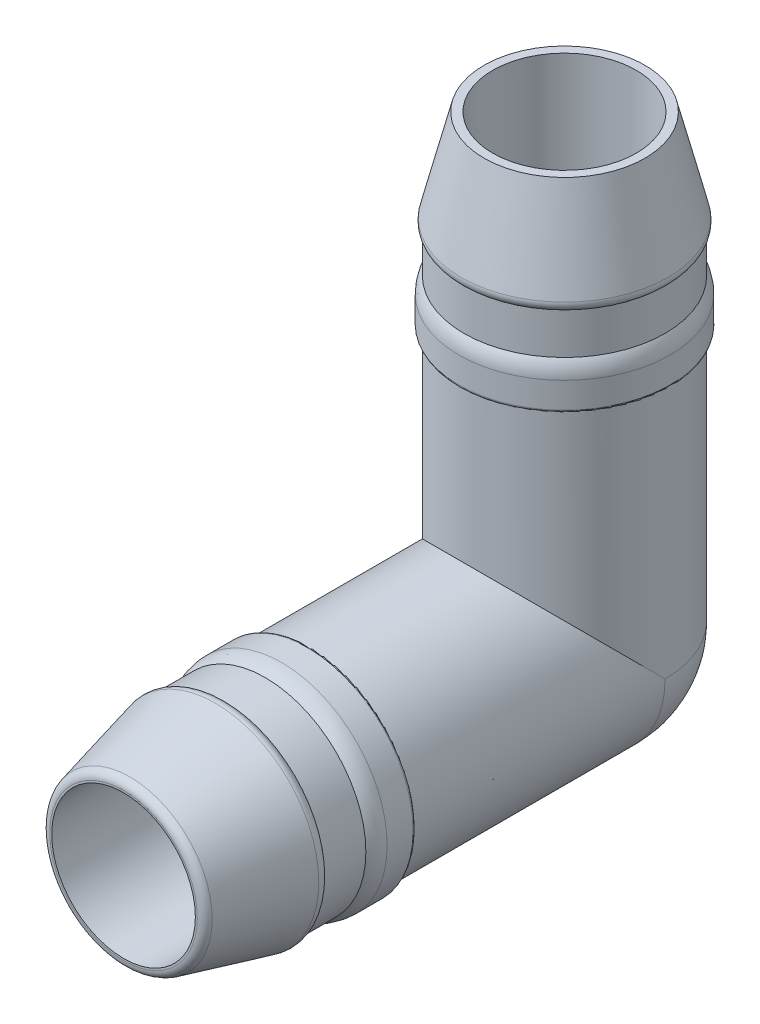
ISO-10303-21;
HEADER;
FILE_DESCRIPTION(('STEP AP214'),'2;1');
FILE_NAME('part.step','',(''),(''),'','','');
FILE_SCHEMA(('AUTOMOTIVE_DESIGN { 1 0 10303 214 1 1 1 1 }'));
ENDSEC;
DATA;
#1=APPLICATION_CONTEXT('core data for automotive mechanical design processes');
#2=APPLICATION_PROTOCOL_DEFINITION('international standard','automotive_design',2000,#1);
#3=PRODUCT_CONTEXT('',#1,'mechanical');
#4=PRODUCT('Part','Part','',(#3));
#5=PRODUCT_RELATED_PRODUCT_CATEGORY('part','',(#4));
#6=PRODUCT_DEFINITION_FORMATION('','',#4);
#7=PRODUCT_DEFINITION_CONTEXT('part definition',#1,'design');
#8=PRODUCT_DEFINITION('design','',#6,#7);
#9=PRODUCT_DEFINITION_SHAPE('','',#8);
#10=(LENGTH_UNIT() NAMED_UNIT(*) SI_UNIT(.MILLI.,.METRE.));
#11=(NAMED_UNIT(*) PLANE_ANGLE_UNIT() SI_UNIT($,.RADIAN.));
#12=(NAMED_UNIT(*) SI_UNIT($,.STERADIAN.) SOLID_ANGLE_UNIT());
#13=UNCERTAINTY_MEASURE_WITH_UNIT(LENGTH_MEASURE(1.E-05),#10,'distance_accuracy_value','');
#14=(GEOMETRIC_REPRESENTATION_CONTEXT(3) GLOBAL_UNCERTAINTY_ASSIGNED_CONTEXT((#13)) GLOBAL_UNIT_ASSIGNED_CONTEXT((#10,
#11,#12)) REPRESENTATION_CONTEXT('',''));
#15=CARTESIAN_POINT('',(0.,0.,0.));
#16=DIRECTION('',(0.,0.,1.));
#17=DIRECTION('',(1.,0.,0.));
#18=AXIS2_PLACEMENT_3D('',#15,#16,#17);
#19=CARTESIAN_POINT('',(0.,0.,8.85));
#20=DIRECTION('',(0.,0.,-1.));
#21=DIRECTION('',(-1.,0.,0.));
#22=AXIS2_PLACEMENT_3D('',#19,#20,#21);
#23=CYLINDRICAL_SURFACE('',#22,3.5);
#24=CARTESIAN_POINT('',(0.,0.,8.85));
#25=DIRECTION('',(0.,0.,1.));
#26=DIRECTION('',(1.,0.,0.));
#27=AXIS2_PLACEMENT_3D('',#24,#25,#26);
#28=CIRCLE('',#27,3.5);
#29=CARTESIAN_POINT('',(3.5,0.,8.85));
#30=VERTEX_POINT('',#29);
#31=EDGE_CURVE('E60',#30,#30,#28,.T.);
#32=ORIENTED_EDGE('',*,*,#31,.F.);
#33=EDGE_LOOP('',(#32));
#34=FACE_BOUND('',#33,.T.);
#35=CARTESIAN_POINT('',(0.,0.,0.));
#36=DIRECTION('',(0.,0.707106781186547,-0.707106781186547));
#37=DIRECTION('',(0.,-0.707106781186547,-0.707106781186547));
#38=AXIS2_PLACEMENT_3D('',#35,#36,#37);
#39=ELLIPSE('',#38,4.94974746830583,3.5);
#40=CARTESIAN_POINT('',(-3.5,0.,0.));
#41=VERTEX_POINT('',#40);
#42=CARTESIAN_POINT('',(3.5,0.,0.));
#43=VERTEX_POINT('',#42);
#44=EDGE_CURVE('E59',#41,#43,#39,.T.);
#45=ORIENTED_EDGE('',*,*,#44,.F.);
#46=CARTESIAN_POINT('',(0.,0.,0.));
#47=DIRECTION('',(0.,0.,1.));
#48=DIRECTION('',(1.,0.,0.));
#49=AXIS2_PLACEMENT_3D('',#46,#47,#48);
#50=CIRCLE('',#49,3.5);
#51=EDGE_CURVE('E48',#41,#43,#50,.T.);
#52=ORIENTED_EDGE('',*,*,#51,.T.);
#53=EDGE_LOOP('',(#45,#52));
#54=FACE_BOUND('',#53,.T.);
#55=ADVANCED_FACE('F33',(#34,#54),#23,.T.);
#56=CARTESIAN_POINT('',(0.,0.,10.85));
#57=DIRECTION('',(0.,0.,-1.));
#58=DIRECTION('',(-1.,0.,0.));
#59=AXIS2_PLACEMENT_3D('',#56,#57,#58);
#60=CYLINDRICAL_SURFACE('',#59,3.675);
#61=CARTESIAN_POINT('',(0.,0.,8.95));
#62=DIRECTION('',(0.,0.,1.));
#63=DIRECTION('',(1.,0.,0.));
#64=AXIS2_PLACEMENT_3D('',#61,#62,#63);
#65=CIRCLE('',#64,3.675);
#66=CARTESIAN_POINT('',(3.675,0.,8.95));
#67=VERTEX_POINT('',#66);
#68=EDGE_CURVE('E87',#67,#67,#65,.T.);
#69=ORIENTED_EDGE('',*,*,#68,.T.);
#70=EDGE_LOOP('',(#69));
#71=FACE_BOUND('',#70,.T.);
#72=CARTESIAN_POINT('',(0.,0.,9.85));
#73=DIRECTION('',(0.,0.,1.));
#74=DIRECTION('',(1.,0.,0.));
#75=AXIS2_PLACEMENT_3D('',#72,#73,#74);
#76=CIRCLE('',#75,3.675);
#77=CARTESIAN_POINT('',(3.675,0.,9.85));
#78=VERTEX_POINT('',#77);
#79=EDGE_CURVE('E71',#78,#78,#76,.F.);
#80=ORIENTED_EDGE('',*,*,#79,.T.);
#81=EDGE_LOOP('',(#80));
#82=FACE_BOUND('',#81,.T.);
#83=ADVANCED_FACE('F123',(#71,#82),#60,.T.);
#84=CARTESIAN_POINT('',(0.,0.,8.85));
#85=DIRECTION('',(0.,0.,1.));
#86=DIRECTION('',(1.,0.,0.));
#87=AXIS2_PLACEMENT_3D('',#84,#85,#86);
#88=PLANE('',#87);
#89=CARTESIAN_POINT('',(0.,0.,8.85));
#90=DIRECTION('',(0.,0.,1.));
#91=DIRECTION('',(1.,0.,0.));
#92=AXIS2_PLACEMENT_3D('',#89,#90,#91);
#93=CIRCLE('',#92,3.575);
#94=CARTESIAN_POINT('',(3.575,0.,8.85));
#95=VERTEX_POINT('',#94);
#96=EDGE_CURVE('E90',#95,#95,#93,.F.);
#97=ORIENTED_EDGE('',*,*,#96,.T.);
#98=EDGE_LOOP('',(#97));
#99=FACE_BOUND('',#98,.T.);
#100=ORIENTED_EDGE('',*,*,#31,.T.);
#101=EDGE_LOOP('',(#100));
#102=FACE_BOUND('',#101,.T.);
#103=ADVANCED_FACE('F129',(#99,#102),#88,.F.);
#104=CARTESIAN_POINT('',(0.,0.,9.85));
#105=DIRECTION('',(0.,0.,1.));
#106=DIRECTION('',(1.,0.,0.));
#107=AXIS2_PLACEMENT_3D('',#104,#105,#106);
#108=TOROIDAL_SURFACE('',#107,2.675,1.);
#109=CARTESIAN_POINT('',(0.,0.,10.4151327277729));
#110=DIRECTION('',(0.,0.,-1.));
#111=DIRECTION('',(-1.,0.,0.));
#112=AXIS2_PLACEMENT_3D('',#109,#110,#111);
#113=CIRCLE('',#112,3.5);
#114=CARTESIAN_POINT('',(-3.5,0.,10.4151327277729));
#115=VERTEX_POINT('',#114);
#116=EDGE_CURVE('E75',#115,#115,#113,.F.);
#117=ORIENTED_EDGE('',*,*,#116,.F.);
#118=EDGE_LOOP('',(#117));
#119=FACE_BOUND('',#118,.T.);
#120=ORIENTED_EDGE('',*,*,#79,.F.);
#121=EDGE_LOOP('',(#120));
#122=FACE_BOUND('',#121,.T.);
#123=ADVANCED_FACE('F135',(#119,#122),#108,.T.);
#124=CARTESIAN_POINT('',(0.,0.,-1.07570752618058));
#125=DIRECTION('',(0.,0.,1.));
#126=DIRECTION('',(1.,0.,0.));
#127=AXIS2_PLACEMENT_3D('',#124,#125,#126);
#128=CYLINDRICAL_SURFACE('',#127,3.5);
#129=ORIENTED_EDGE('',*,*,#116,.T.);
#130=EDGE_LOOP('',(#129));
#131=FACE_BOUND('',#130,.T.);
#132=CARTESIAN_POINT('',(0.,0.,11.85));
#133=DIRECTION('',(0.,0.,1.));
#134=DIRECTION('',(1.,0.,0.));
#135=AXIS2_PLACEMENT_3D('',#132,#133,#134);
#136=CIRCLE('',#135,3.5);
#137=CARTESIAN_POINT('',(3.5,0.,11.85));
#138=VERTEX_POINT('',#137);
#139=EDGE_CURVE('E61',#138,#138,#136,.T.);
#140=ORIENTED_EDGE('',*,*,#139,.F.);
#141=EDGE_LOOP('',(#140));
#142=FACE_BOUND('',#141,.T.);
#143=ADVANCED_FACE('F138',(#131,#142),#128,.T.);
#144=CARTESIAN_POINT('',(0.,0.,11.85));
#145=DIRECTION('',(0.,0.,-1.));
#146=DIRECTION('',(1.,0.,0.));
#147=AXIS2_PLACEMENT_3D('',#144,#145,#146);
#148=CONICAL_SURFACE('',#147,3.675,0.244346095279207);
#149=CARTESIAN_POINT('',(0.,0.,12.1533251530703));
#150=DIRECTION('',(0.,0.,1.));
#151=DIRECTION('',(1.,0.,0.));
#152=AXIS2_PLACEMENT_3D('',#149,#150,#151);
#153=CIRCLE('',#152,3.59937254537288);
#154=CARTESIAN_POINT('',(3.59937254537288,0.,12.1533251530703));
#155=VERTEX_POINT('',#154);
#156=EDGE_CURVE('E81',#155,#155,#153,.T.);
#157=ORIENTED_EDGE('',*,*,#156,.T.);
#158=EDGE_LOOP('',(#157));
#159=FACE_BOUND('',#158,.T.);
#160=CARTESIAN_POINT('',(0.,0.,15.1225765686799));
#161=DIRECTION('',(0.,0.,-1.));
#162=DIRECTION('',(-1.,0.,0.));
#163=AXIS2_PLACEMENT_3D('',#160,#161,#162);
#164=CIRCLE('',#163,2.85905501997965);
#165=CARTESIAN_POINT('',(-2.85905501997965,0.,15.1225765686799));
#166=VERTEX_POINT('',#165);
#167=EDGE_CURVE('E78',#166,#166,#164,.T.);
#168=ORIENTED_EDGE('',*,*,#167,.T.);
#169=EDGE_LOOP('',(#168));
#170=FACE_BOUND('',#169,.T.);
#171=ADVANCED_FACE('F180',(#159,#170),#148,.T.);
#172=CARTESIAN_POINT('',(0.,0.,15.35));
#173=DIRECTION('',(0.,0.,1.));
#174=DIRECTION('',(1.,0.,0.));
#175=AXIS2_PLACEMENT_3D('',#172,#173,#174);
#176=PLANE('',#175);
#177=CARTESIAN_POINT('',(0.,0.,15.35));
#178=DIRECTION('',(0.,0.,1.));
#179=DIRECTION('',(1.,0.,0.));
#180=AXIS2_PLACEMENT_3D('',#177,#178,#179);
#181=CIRCLE('',#180,2.5);
#182=CARTESIAN_POINT('',(2.5,0.,15.35));
#183=VERTEX_POINT('',#182);
#184=EDGE_CURVE('E320',#183,#183,#181,.T.);
#185=ORIENTED_EDGE('',*,*,#184,.F.);
#186=EDGE_LOOP('',(#185));
#187=FACE_BOUND('',#186,.T.);
#188=CARTESIAN_POINT('',(0.,0.,15.35));
#189=DIRECTION('',(0.,0.,1.));
#190=DIRECTION('',(1.,0.,0.));
#191=AXIS2_PLACEMENT_3D('',#188,#189,#190);
#192=CIRCLE('',#191,2.56796630209685);
#193=CARTESIAN_POINT('',(2.56796630209685,0.,15.35));
#194=VERTEX_POINT('',#193);
#195=EDGE_CURVE('E84',#194,#194,#192,.T.);
#196=ORIENTED_EDGE('',*,*,#195,.T.);
#197=EDGE_LOOP('',(#196));
#198=FACE_BOUND('',#197,.T.);
#199=ADVANCED_FACE('F144',(#187,#198),#176,.T.);
#200=CARTESIAN_POINT('',(0.,0.,12.0807485843904));
#201=DIRECTION('',(0.,0.,-1.));
#202=DIRECTION('',(-1.,0.,0.));
#203=AXIS2_PLACEMENT_3D('',#200,#201,#202);
#204=TOROIDAL_SURFACE('',#203,3.30828382749009,0.3);
#205=ORIENTED_EDGE('',*,*,#139,.T.);
#206=EDGE_LOOP('',(#205));
#207=FACE_BOUND('',#206,.T.);
#208=ORIENTED_EDGE('',*,*,#156,.F.);
#209=EDGE_LOOP('',(#208));
#210=FACE_BOUND('',#209,.T.);
#211=ADVANCED_FACE('F140',(#207,#210),#204,.T.);
#212=CARTESIAN_POINT('',(0.,0.,15.05));
#213=DIRECTION('',(0.,0.,1.));
#214=DIRECTION('',(1.,0.,0.));
#215=AXIS2_PLACEMENT_3D('',#212,#213,#214);
#216=TOROIDAL_SURFACE('',#215,2.56796630209685,0.3);
#217=ORIENTED_EDGE('',*,*,#167,.F.);
#218=EDGE_LOOP('',(#217));
#219=FACE_BOUND('',#218,.T.);
#220=ORIENTED_EDGE('',*,*,#195,.F.);
#221=EDGE_LOOP('',(#220));
#222=FACE_BOUND('',#221,.T.);
#223=ADVANCED_FACE('F143',(#219,#222),#216,.T.);
#224=CARTESIAN_POINT('',(0.,0.,8.95));
#225=DIRECTION('',(0.,0.,1.));
#226=DIRECTION('',(1.,0.,0.));
#227=AXIS2_PLACEMENT_3D('',#224,#225,#226);
#228=TOROIDAL_SURFACE('',#227,3.575,0.1);
#229=ORIENTED_EDGE('',*,*,#96,.F.);
#230=EDGE_LOOP('',(#229));
#231=FACE_BOUND('',#230,.T.);
#232=ORIENTED_EDGE('',*,*,#68,.F.);
#233=EDGE_LOOP('',(#232));
#234=FACE_BOUND('',#233,.T.);
#235=ADVANCED_FACE('F148',(#231,#234),#228,.T.);
#236=CARTESIAN_POINT('',(0.,8.85,0.));
#237=DIRECTION('',(0.,-1.,0.));
#238=DIRECTION('',(0.,0.,-1.));
#239=AXIS2_PLACEMENT_3D('',#236,#237,#238);
#240=CYLINDRICAL_SURFACE('',#239,3.5);
#241=CARTESIAN_POINT('',(0.,8.85,0.));
#242=DIRECTION('',(0.,1.,0.));
#243=DIRECTION('',(0.,0.,1.));
#244=AXIS2_PLACEMENT_3D('',#241,#242,#243);
#245=CIRCLE('',#244,3.5);
#246=CARTESIAN_POINT('',(0.,8.85,3.5));
#247=VERTEX_POINT('',#246);
#248=EDGE_CURVE('E55',#247,#247,#245,.T.);
#249=ORIENTED_EDGE('',*,*,#248,.F.);
#250=EDGE_LOOP('',(#249));
#251=FACE_BOUND('',#250,.T.);
#252=CARTESIAN_POINT('',(0.,0.,0.));
#253=DIRECTION('',(0.,1.,0.));
#254=DIRECTION('',(0.,0.,1.));
#255=AXIS2_PLACEMENT_3D('',#252,#253,#254);
#256=CIRCLE('',#255,3.5);
#257=EDGE_CURVE('E51',#43,#41,#256,.T.);
#258=ORIENTED_EDGE('',*,*,#257,.T.);
#259=ORIENTED_EDGE('',*,*,#44,.T.);
#260=EDGE_LOOP('',(#258,#259));
#261=FACE_BOUND('',#260,.T.);
#262=ADVANCED_FACE('F63',(#251,#261),#240,.T.);
#263=CARTESIAN_POINT('',(0.,10.85,0.));
#264=DIRECTION('',(0.,-1.,0.));
#265=DIRECTION('',(0.,0.,-1.));
#266=AXIS2_PLACEMENT_3D('',#263,#264,#265);
#267=CYLINDRICAL_SURFACE('',#266,3.675);
#268=CARTESIAN_POINT('',(0.,8.95,0.));
#269=DIRECTION('',(0.,1.,0.));
#270=DIRECTION('',(0.,0.,1.));
#271=AXIS2_PLACEMENT_3D('',#268,#269,#270);
#272=CIRCLE('',#271,3.675);
#273=CARTESIAN_POINT('',(0.,8.95,3.675));
#274=VERTEX_POINT('',#273);
#275=EDGE_CURVE('E42',#274,#274,#272,.T.);
#276=ORIENTED_EDGE('',*,*,#275,.T.);
#277=EDGE_LOOP('',(#276));
#278=FACE_BOUND('',#277,.T.);
#279=CARTESIAN_POINT('',(0.,9.85,0.));
#280=DIRECTION('',(0.,1.,0.));
#281=DIRECTION('',(0.,0.,1.));
#282=AXIS2_PLACEMENT_3D('',#279,#280,#281);
#283=CIRCLE('',#282,3.675);
#284=CARTESIAN_POINT('',(0.,9.85,3.675));
#285=VERTEX_POINT('',#284);
#286=EDGE_CURVE('E93',#285,#285,#283,.F.);
#287=ORIENTED_EDGE('',*,*,#286,.T.);
#288=EDGE_LOOP('',(#287));
#289=FACE_BOUND('',#288,.T.);
#290=ADVANCED_FACE('F105',(#278,#289),#267,.T.);
#291=CARTESIAN_POINT('',(0.,8.85,0.));
#292=DIRECTION('',(0.,1.,0.));
#293=DIRECTION('',(0.,0.,1.));
#294=AXIS2_PLACEMENT_3D('',#291,#292,#293);
#295=PLANE('',#294);
#296=CARTESIAN_POINT('',(0.,8.85,0.));
#297=DIRECTION('',(0.,1.,0.));
#298=DIRECTION('',(0.,0.,1.));
#299=AXIS2_PLACEMENT_3D('',#296,#297,#298);
#300=CIRCLE('',#299,3.575);
#301=CARTESIAN_POINT('',(0.,8.85,3.575));
#302=VERTEX_POINT('',#301);
#303=EDGE_CURVE('E11',#302,#302,#300,.F.);
#304=ORIENTED_EDGE('',*,*,#303,.T.);
#305=EDGE_LOOP('',(#304));
#306=FACE_BOUND('',#305,.T.);
#307=ORIENTED_EDGE('',*,*,#248,.T.);
#308=EDGE_LOOP('',(#307));
#309=FACE_BOUND('',#308,.T.);
#310=ADVANCED_FACE('F156',(#306,#309),#295,.F.);
#311=CARTESIAN_POINT('',(0.,9.85,0.));
#312=DIRECTION('',(0.,1.,0.));
#313=DIRECTION('',(0.,0.,1.));
#314=AXIS2_PLACEMENT_3D('',#311,#312,#313);
#315=TOROIDAL_SURFACE('',#314,2.675,1.);
#316=CARTESIAN_POINT('',(0.,10.4151327277729,0.));
#317=DIRECTION('',(0.,-1.,0.));
#318=DIRECTION('',(0.,0.,-1.));
#319=AXIS2_PLACEMENT_3D('',#316,#317,#318);
#320=CIRCLE('',#319,3.5);
#321=CARTESIAN_POINT('',(0.,10.4151327277729,-3.5));
#322=VERTEX_POINT('',#321);
#323=EDGE_CURVE('E96',#322,#322,#320,.F.);
#324=ORIENTED_EDGE('',*,*,#323,.F.);
#325=EDGE_LOOP('',(#324));
#326=FACE_BOUND('',#325,.T.);
#327=ORIENTED_EDGE('',*,*,#286,.F.);
#328=EDGE_LOOP('',(#327));
#329=FACE_BOUND('',#328,.T.);
#330=ADVANCED_FACE('F153',(#326,#329),#315,.T.);
#331=CARTESIAN_POINT('',(0.,-3.676,0.));
#332=DIRECTION('',(0.,1.,0.));
#333=DIRECTION('',(0.,0.,1.));
#334=AXIS2_PLACEMENT_3D('',#331,#332,#333);
#335=CYLINDRICAL_SURFACE('',#334,3.5);
#336=ORIENTED_EDGE('',*,*,#323,.T.);
#337=EDGE_LOOP('',(#336));
#338=FACE_BOUND('',#337,.T.);
#339=CARTESIAN_POINT('',(0.,11.85,0.));
#340=DIRECTION('',(0.,1.,0.));
#341=DIRECTION('',(0.,0.,1.));
#342=AXIS2_PLACEMENT_3D('',#339,#340,#341);
#343=CIRCLE('',#342,3.5);
#344=CARTESIAN_POINT('',(0.,11.85,3.5));
#345=VERTEX_POINT('',#344);
#346=EDGE_CURVE('E56',#345,#345,#343,.T.);
#347=ORIENTED_EDGE('',*,*,#346,.F.);
#348=EDGE_LOOP('',(#347));
#349=FACE_BOUND('',#348,.T.);
#350=ADVANCED_FACE('F155',(#338,#349),#335,.T.);
#351=CARTESIAN_POINT('',(0.,11.85,0.));
#352=DIRECTION('',(0.,-1.,0.));
#353=DIRECTION('',(0.,0.,1.));
#354=AXIS2_PLACEMENT_3D('',#351,#352,#353);
#355=CONICAL_SURFACE('',#354,3.675,0.244346095279207);
#356=CARTESIAN_POINT('',(0.,12.1533251530703,0.));
#357=DIRECTION('',(0.,1.,0.));
#358=DIRECTION('',(0.,0.,1.));
#359=AXIS2_PLACEMENT_3D('',#356,#357,#358);
#360=CIRCLE('',#359,3.59937254537288);
#361=CARTESIAN_POINT('',(0.,12.1533251530703,3.59937254537288));
#362=VERTEX_POINT('',#361);
#363=EDGE_CURVE('E99',#362,#362,#360,.T.);
#364=ORIENTED_EDGE('',*,*,#363,.T.);
#365=EDGE_LOOP('',(#364));
#366=FACE_BOUND('',#365,.T.);
#367=CARTESIAN_POINT('',(0.,15.35,0.));
#368=DIRECTION('',(0.,1.,0.));
#369=DIRECTION('',(0.,0.,1.));
#370=AXIS2_PLACEMENT_3D('',#367,#368,#369);
#371=CIRCLE('',#370,2.80235199004887);
#372=CARTESIAN_POINT('',(0.,15.35,2.80235199004887));
#373=VERTEX_POINT('',#372);
#374=EDGE_CURVE('E315',#373,#373,#371,.T.);
#375=ORIENTED_EDGE('',*,*,#374,.F.);
#376=EDGE_LOOP('',(#375));
#377=FACE_BOUND('',#376,.T.);
#378=ADVANCED_FACE('F162',(#366,#377),#355,.T.);
#379=CARTESIAN_POINT('',(0.,15.35,0.));
#380=DIRECTION('',(0.,1.,0.));
#381=DIRECTION('',(0.,0.,1.));
#382=AXIS2_PLACEMENT_3D('',#379,#380,#381);
#383=PLANE('',#382);
#384=CARTESIAN_POINT('',(0.,15.35,0.));
#385=DIRECTION('',(0.,1.,0.));
#386=DIRECTION('',(0.,0.,1.));
#387=AXIS2_PLACEMENT_3D('',#384,#385,#386);
#388=CIRCLE('',#387,2.5);
#389=CARTESIAN_POINT('',(0.,15.35,2.5));
#390=VERTEX_POINT('',#389);
#391=EDGE_CURVE('E37',#390,#390,#388,.F.);
#392=ORIENTED_EDGE('',*,*,#391,.T.);
#393=EDGE_LOOP('',(#392));
#394=FACE_BOUND('',#393,.T.);
#395=ORIENTED_EDGE('',*,*,#374,.T.);
#396=EDGE_LOOP('',(#395));
#397=FACE_BOUND('',#396,.T.);
#398=ADVANCED_FACE('F246',(#394,#397),#383,.T.);
#399=CARTESIAN_POINT('',(0.,0.,0.));
#400=DIRECTION('',(-1.,0.,0.));
#401=DIRECTION('',(0.,0.,-1.));
#402=AXIS2_PLACEMENT_3D('',#399,#400,#401);
#403=SPHERICAL_SURFACE('',#402,3.5);
#404=ORIENTED_EDGE('',*,*,#51,.F.);
#405=ORIENTED_EDGE('',*,*,#257,.F.);
#406=EDGE_LOOP('',(#404,#405));
#407=FACE_BOUND('',#406,.T.);
#408=ADVANCED_FACE('F52',(#407),#403,.T.);
#409=CARTESIAN_POINT('',(0.,12.0807485843904,0.));
#410=DIRECTION('',(0.,-1.,0.));
#411=DIRECTION('',(0.,0.,-1.));
#412=AXIS2_PLACEMENT_3D('',#409,#410,#411);
#413=TOROIDAL_SURFACE('',#412,3.30828382749009,0.3);
#414=ORIENTED_EDGE('',*,*,#346,.T.);
#415=EDGE_LOOP('',(#414));
#416=FACE_BOUND('',#415,.T.);
#417=ORIENTED_EDGE('',*,*,#363,.F.);
#418=EDGE_LOOP('',(#417));
#419=FACE_BOUND('',#418,.T.);
#420=ADVANCED_FACE('F110',(#416,#419),#413,.T.);
#421=CARTESIAN_POINT('',(0.,8.95,0.));
#422=DIRECTION('',(0.,1.,0.));
#423=DIRECTION('',(0.,0.,1.));
#424=AXIS2_PLACEMENT_3D('',#421,#422,#423);
#425=TOROIDAL_SURFACE('',#424,3.575,0.1);
#426=ORIENTED_EDGE('',*,*,#303,.F.);
#427=EDGE_LOOP('',(#426));
#428=FACE_BOUND('',#427,.T.);
#429=ORIENTED_EDGE('',*,*,#275,.F.);
#430=EDGE_LOOP('',(#429));
#431=FACE_BOUND('',#430,.T.);
#432=ADVANCED_FACE('F35',(#428,#431),#425,.T.);
#433=CARTESIAN_POINT('',(0.,0.,20.35));
#434=DIRECTION('',(0.,0.,-1.));
#435=DIRECTION('',(-1.,0.,0.));
#436=AXIS2_PLACEMENT_3D('',#433,#434,#435);
#437=CYLINDRICAL_SURFACE('',#436,2.5);
#438=CARTESIAN_POINT('',(0.,0.,3.5));
#439=DIRECTION('',(0.,0.,1.));
#440=DIRECTION('',(1.,0.,0.));
#441=AXIS2_PLACEMENT_3D('',#438,#439,#440);
#442=CIRCLE('',#441,2.5);
#443=CARTESIAN_POINT('',(0.,-2.5,3.5));
#444=VERTEX_POINT('',#443);
#445=EDGE_CURVE('E325',#444,#444,#442,.T.);
#446=ORIENTED_EDGE('',*,*,#445,.F.);
#447=EDGE_LOOP('',(#446));
#448=FACE_BOUND('',#447,.T.);
#449=ORIENTED_EDGE('',*,*,#184,.T.);
#450=EDGE_LOOP('',(#449));
#451=FACE_BOUND('',#450,.T.);
#452=ADVANCED_FACE('F109',(#448,#451),#437,.F.);
#453=CARTESIAN_POINT('',(0.,3.5,3.5));
#454=DIRECTION('',(1.,0.,0.));
#455=DIRECTION('',(0.,0.,-1.));
#456=AXIS2_PLACEMENT_3D('',#453,#454,#455);
#457=TOROIDAL_SURFACE('',#456,3.5,2.5);
#458=CARTESIAN_POINT('',(0.,3.5,0.));
#459=DIRECTION('',(0.,-1.,0.));
#460=DIRECTION('',(1.,0.,0.));
#461=AXIS2_PLACEMENT_3D('',#458,#459,#460);
#462=CIRCLE('',#461,2.5);
#463=CARTESIAN_POINT('',(0.,3.5,-2.5));
#464=VERTEX_POINT('',#463);
#465=EDGE_CURVE('E324',#464,#464,#462,.T.);
#466=CARTESIAN_POINT('',(0.,3.5,3.5));
#467=DIRECTION('',(1.,0.,0.));
#468=DIRECTION('',(0.,0.,-1.));
#469=AXIS2_PLACEMENT_3D('',#466,#467,#468);
#470=CIRCLE('',#469,6.);
#471=EDGE_CURVE('',#444,#464,#470,.T.);
#472=ORIENTED_EDGE('',*,*,#445,.T.);
#473=ORIENTED_EDGE('',*,*,#465,.F.);
#474=ORIENTED_EDGE('',*,*,#471,.T.);
#475=ORIENTED_EDGE('',*,*,#471,.F.);
#476=EDGE_LOOP('',(#472,#474,#473,#475));
#477=FACE_BOUND('',#476,.T.);
#478=ADVANCED_FACE('F116',(#477),#457,.F.);
#479=CARTESIAN_POINT('',(0.,3.5,0.));
#480=DIRECTION('',(0.,1.,0.));
#481=DIRECTION('',(0.,0.,1.));
#482=AXIS2_PLACEMENT_3D('',#479,#480,#481);
#483=CYLINDRICAL_SURFACE('',#482,2.5);
#484=ORIENTED_EDGE('',*,*,#391,.F.);
#485=EDGE_LOOP('',(#484));
#486=FACE_BOUND('',#485,.T.);
#487=ORIENTED_EDGE('',*,*,#465,.T.);
#488=EDGE_LOOP('',(#487));
#489=FACE_BOUND('',#488,.T.);
#490=ADVANCED_FACE('F119',(#486,#489),#483,.F.);
#491=CLOSED_SHELL('',(#55,#83,#103,#123,#143,#171,#199,#211,#223,#235,#262,#290,#310,#330,#350,
#378,#398,#408,#420,#432,#452,#478,#490));
#492=MANIFOLD_SOLID_BREP('B2',#491);
#493=ADVANCED_BREP_SHAPE_REPRESENTATION('',(#18,#492),#14);
#494=SHAPE_DEFINITION_REPRESENTATION(#9,#493);
ENDSEC;
END-ISO-10303-21;
